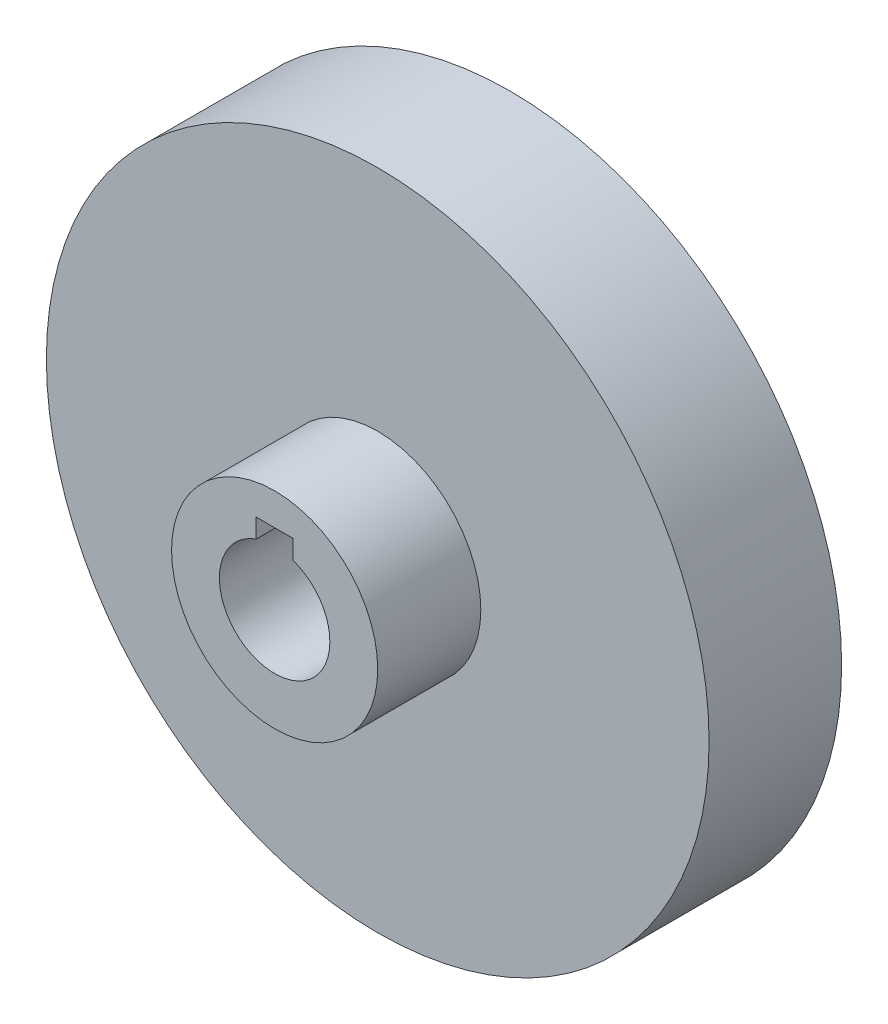
ISO-10303-21;
HEADER;
FILE_DESCRIPTION(('STEP AP214'),'2;1');
FILE_NAME('part.step','',(''),(''),'','','');
FILE_SCHEMA(('AUTOMOTIVE_DESIGN { 1 0 10303 214 1 1 1 1 }'));
ENDSEC;
DATA;
#1=APPLICATION_CONTEXT('core data for automotive mechanical design processes');
#2=APPLICATION_PROTOCOL_DEFINITION('international standard','automotive_design',2000,#1);
#3=PRODUCT_CONTEXT('',#1,'mechanical');
#4=PRODUCT('Part','Part','',(#3));
#5=PRODUCT_RELATED_PRODUCT_CATEGORY('part','',(#4));
#6=PRODUCT_DEFINITION_FORMATION('','',#4);
#7=PRODUCT_DEFINITION_CONTEXT('part definition',#1,'design');
#8=PRODUCT_DEFINITION('design','',#6,#7);
#9=PRODUCT_DEFINITION_SHAPE('','',#8);
#10=(LENGTH_UNIT() NAMED_UNIT(*) SI_UNIT(.MILLI.,.METRE.));
#11=(NAMED_UNIT(*) PLANE_ANGLE_UNIT() SI_UNIT($,.RADIAN.));
#12=(NAMED_UNIT(*) SI_UNIT($,.STERADIAN.) SOLID_ANGLE_UNIT());
#13=UNCERTAINTY_MEASURE_WITH_UNIT(LENGTH_MEASURE(1.E-05),#10,'distance_accuracy_value','');
#14=(GEOMETRIC_REPRESENTATION_CONTEXT(3) GLOBAL_UNCERTAINTY_ASSIGNED_CONTEXT((#13)) GLOBAL_UNIT_ASSIGNED_CONTEXT((#10,
#11,#12)) REPRESENTATION_CONTEXT('',''));
#15=CARTESIAN_POINT('',(0.,0.,0.));
#16=DIRECTION('',(0.,0.,1.));
#17=DIRECTION('',(1.,0.,0.));
#18=AXIS2_PLACEMENT_3D('',#15,#16,#17);
#19=CARTESIAN_POINT('',(0.,0.,42.784));
#20=DIRECTION('',(0.,0.,1.));
#21=DIRECTION('',(1.,0.,0.));
#22=AXIS2_PLACEMENT_3D('',#19,#20,#21);
#23=CYLINDRICAL_SURFACE('',#22,7.5);
#24=DIRECTION('',(0.,0.,1.));
#25=VECTOR('',#24,1.);
#26=CARTESIAN_POINT('',(-2.5,7.07106781186547,42.784));
#27=LINE('',#26,#25);
#28=CARTESIAN_POINT('',(-2.5,7.07106781186547,23.));
#29=VERTEX_POINT('',#28);
#30=CARTESIAN_POINT('',(-2.5,7.07106781186548,-12.));
#31=VERTEX_POINT('',#30);
#32=EDGE_CURVE('E96',#29,#31,#27,.F.);
#33=ORIENTED_EDGE('',*,*,#32,.F.);
#34=CARTESIAN_POINT('',(0.,0.,23.));
#35=DIRECTION('',(0.,0.,1.));
#36=DIRECTION('',(1.,0.,0.));
#37=AXIS2_PLACEMENT_3D('',#34,#35,#36);
#38=CIRCLE('',#37,7.5);
#39=CARTESIAN_POINT('',(2.5,7.07106781186547,23.));
#40=VERTEX_POINT('',#39);
#41=EDGE_CURVE('E87',#29,#40,#38,.T.);
#42=ORIENTED_EDGE('',*,*,#41,.T.);
#43=DIRECTION('',(0.,0.,1.));
#44=VECTOR('',#43,1.);
#45=CARTESIAN_POINT('',(2.5,7.07106781186547,42.784));
#46=LINE('',#45,#44);
#47=CARTESIAN_POINT('',(2.5,7.07106781186548,-12.));
#48=VERTEX_POINT('',#47);
#49=EDGE_CURVE('E92',#40,#48,#46,.F.);
#50=ORIENTED_EDGE('',*,*,#49,.T.);
#51=CARTESIAN_POINT('',(0.,0.,-12.));
#52=DIRECTION('',(0.,0.,1.));
#53=DIRECTION('',(1.,0.,0.));
#54=AXIS2_PLACEMENT_3D('',#51,#52,#53);
#55=CIRCLE('',#54,7.5);
#56=EDGE_CURVE('E98',#31,#48,#55,.T.);
#57=ORIENTED_EDGE('',*,*,#56,.F.);
#58=EDGE_LOOP('',(#33,#42,#50,#57));
#59=FACE_BOUND('',#58,.T.);
#60=ADVANCED_FACE('F32',(#59),#23,.F.);
#61=CARTESIAN_POINT('',(0.,7.5,23.));
#62=DIRECTION('',(0.,0.,-1.));
#63=DIRECTION('',(-1.,0.,0.));
#64=AXIS2_PLACEMENT_3D('',#61,#62,#63);
#65=PLANE('',#64);
#66=CARTESIAN_POINT('',(0.,0.,23.));
#67=DIRECTION('',(0.,0.,1.));
#68=DIRECTION('',(1.,0.,0.));
#69=AXIS2_PLACEMENT_3D('',#66,#67,#68);
#70=CIRCLE('',#69,14.);
#71=CARTESIAN_POINT('',(14.,0.,23.));
#72=VERTEX_POINT('',#71);
#73=EDGE_CURVE('E116',#72,#72,#70,.T.);
#74=ORIENTED_EDGE('',*,*,#73,.T.);
#75=EDGE_LOOP('',(#74));
#76=FACE_BOUND('',#75,.T.);
#77=DIRECTION('',(0.,-1.,0.));
#78=VECTOR('',#77,1.);
#79=CARTESIAN_POINT('',(-2.5,9.65,23.));
#80=LINE('',#79,#78);
#81=CARTESIAN_POINT('',(-2.5,9.65,23.));
#82=VERTEX_POINT('',#81);
#83=EDGE_CURVE('E54',#82,#29,#80,.T.);
#84=ORIENTED_EDGE('',*,*,#83,.F.);
#85=DIRECTION('',(1.,0.,0.));
#86=VECTOR('',#85,1.);
#87=CARTESIAN_POINT('',(-2.5,9.65,23.));
#88=LINE('',#87,#86);
#89=CARTESIAN_POINT('',(2.5,9.65,23.));
#90=VERTEX_POINT('',#89);
#91=EDGE_CURVE('E72',#82,#90,#88,.T.);
#92=ORIENTED_EDGE('',*,*,#91,.T.);
#93=DIRECTION('',(0.,-1.,0.));
#94=VECTOR('',#93,1.);
#95=CARTESIAN_POINT('',(2.5,9.65,23.));
#96=LINE('',#95,#94);
#97=EDGE_CURVE('E82',#90,#40,#96,.T.);
#98=ORIENTED_EDGE('',*,*,#97,.T.);
#99=ORIENTED_EDGE('',*,*,#41,.F.);
#100=EDGE_LOOP('',(#84,#92,#98,#99));
#101=FACE_BOUND('',#100,.T.);
#102=ADVANCED_FACE('F85',(#76,#101),#65,.F.);
#103=CARTESIAN_POINT('',(0.,14.,-12.));
#104=DIRECTION('',(0.,0.,1.));
#105=DIRECTION('',(1.,0.,0.));
#106=AXIS2_PLACEMENT_3D('',#103,#104,#105);
#107=PLANE('',#106);
#108=CARTESIAN_POINT('',(0.,0.,-12.));
#109=DIRECTION('',(0.,0.,1.));
#110=DIRECTION('',(1.,0.,0.));
#111=AXIS2_PLACEMENT_3D('',#108,#109,#110);
#112=CIRCLE('',#111,14.);
#113=CARTESIAN_POINT('',(14.,0.,-12.));
#114=VERTEX_POINT('',#113);
#115=EDGE_CURVE('E101',#114,#114,#112,.T.);
#116=ORIENTED_EDGE('',*,*,#115,.F.);
#117=EDGE_LOOP('',(#116));
#118=FACE_BOUND('',#117,.T.);
#119=DIRECTION('',(0.,1.,0.));
#120=VECTOR('',#119,1.);
#121=CARTESIAN_POINT('',(-2.5,14.,-12.));
#122=LINE('',#121,#120);
#123=CARTESIAN_POINT('',(-2.5,10.,-12.));
#124=VERTEX_POINT('',#123);
#125=EDGE_CURVE('E11',#31,#124,#122,.T.);
#126=ORIENTED_EDGE('',*,*,#125,.F.);
#127=ORIENTED_EDGE('',*,*,#56,.T.);
#128=DIRECTION('',(0.,1.,0.));
#129=VECTOR('',#128,1.);
#130=CARTESIAN_POINT('',(2.5,14.,-12.));
#131=LINE('',#130,#129);
#132=CARTESIAN_POINT('',(2.5,10.,-12.));
#133=VERTEX_POINT('',#132);
#134=EDGE_CURVE('E39',#48,#133,#131,.T.);
#135=ORIENTED_EDGE('',*,*,#134,.T.);
#136=DIRECTION('',(1.,0.,0.));
#137=VECTOR('',#136,1.);
#138=CARTESIAN_POINT('',(-2.5,10.,-12.));
#139=LINE('',#138,#137);
#140=EDGE_CURVE('E78',#124,#133,#139,.T.);
#141=ORIENTED_EDGE('',*,*,#140,.F.);
#142=EDGE_LOOP('',(#126,#127,#135,#141));
#143=FACE_BOUND('',#142,.T.);
#144=ADVANCED_FACE('F121',(#118,#143),#107,.F.);
#145=CARTESIAN_POINT('',(0.,0.,42.784));
#146=DIRECTION('',(0.,0.,1.));
#147=DIRECTION('',(1.,0.,0.));
#148=AXIS2_PLACEMENT_3D('',#145,#146,#147);
#149=CYLINDRICAL_SURFACE('',#148,14.);
#150=ORIENTED_EDGE('',*,*,#73,.F.);
#151=EDGE_LOOP('',(#150));
#152=FACE_BOUND('',#151,.T.);
#153=CARTESIAN_POINT('',(0.,0.,9.));
#154=DIRECTION('',(0.,0.,1.));
#155=DIRECTION('',(1.,0.,0.));
#156=AXIS2_PLACEMENT_3D('',#153,#154,#155);
#157=CIRCLE('',#156,14.);
#158=CARTESIAN_POINT('',(14.,0.,9.));
#159=VERTEX_POINT('',#158);
#160=EDGE_CURVE('E113',#159,#159,#157,.T.);
#161=ORIENTED_EDGE('',*,*,#160,.T.);
#162=EDGE_LOOP('',(#161));
#163=FACE_BOUND('',#162,.T.);
#164=ADVANCED_FACE('F133',(#152,#163),#149,.T.);
#165=CARTESIAN_POINT('',(0.,14.,9.));
#166=DIRECTION('',(0.,0.,-1.));
#167=DIRECTION('',(-1.,0.,0.));
#168=AXIS2_PLACEMENT_3D('',#165,#166,#167);
#169=PLANE('',#168);
#170=ORIENTED_EDGE('',*,*,#160,.F.);
#171=EDGE_LOOP('',(#170));
#172=FACE_BOUND('',#171,.T.);
#173=CARTESIAN_POINT('',(0.,0.,9.));
#174=DIRECTION('',(0.,0.,1.));
#175=DIRECTION('',(1.,0.,0.));
#176=AXIS2_PLACEMENT_3D('',#173,#174,#175);
#177=CIRCLE('',#176,45.);
#178=CARTESIAN_POINT('',(45.,0.,9.));
#179=VERTEX_POINT('',#178);
#180=EDGE_CURVE('E110',#179,#179,#177,.T.);
#181=ORIENTED_EDGE('',*,*,#180,.T.);
#182=EDGE_LOOP('',(#181));
#183=FACE_BOUND('',#182,.T.);
#184=ADVANCED_FACE('F139',(#172,#183),#169,.F.);
#185=CARTESIAN_POINT('',(0.,0.,42.784));
#186=DIRECTION('',(0.,0.,1.));
#187=DIRECTION('',(1.,0.,0.));
#188=AXIS2_PLACEMENT_3D('',#185,#186,#187);
#189=CYLINDRICAL_SURFACE('',#188,45.);
#190=ORIENTED_EDGE('',*,*,#180,.F.);
#191=EDGE_LOOP('',(#190));
#192=FACE_BOUND('',#191,.T.);
#193=CARTESIAN_POINT('',(0.,0.,-9.));
#194=DIRECTION('',(0.,0.,1.));
#195=DIRECTION('',(1.,0.,0.));
#196=AXIS2_PLACEMENT_3D('',#193,#194,#195);
#197=CIRCLE('',#196,45.);
#198=CARTESIAN_POINT('',(45.,0.,-9.));
#199=VERTEX_POINT('',#198);
#200=EDGE_CURVE('E107',#199,#199,#197,.T.);
#201=ORIENTED_EDGE('',*,*,#200,.T.);
#202=EDGE_LOOP('',(#201));
#203=FACE_BOUND('',#202,.T.);
#204=ADVANCED_FACE('F143',(#192,#203),#189,.T.);
#205=CARTESIAN_POINT('',(0.,45.,-9.));
#206=DIRECTION('',(0.,0.,1.));
#207=DIRECTION('',(1.,0.,0.));
#208=AXIS2_PLACEMENT_3D('',#205,#206,#207);
#209=PLANE('',#208);
#210=ORIENTED_EDGE('',*,*,#200,.F.);
#211=EDGE_LOOP('',(#210));
#212=FACE_BOUND('',#211,.T.);
#213=CARTESIAN_POINT('',(0.,0.,-9.));
#214=DIRECTION('',(0.,0.,1.));
#215=DIRECTION('',(1.,0.,0.));
#216=AXIS2_PLACEMENT_3D('',#213,#214,#215);
#217=CIRCLE('',#216,14.);
#218=CARTESIAN_POINT('',(14.,0.,-9.));
#219=VERTEX_POINT('',#218);
#220=EDGE_CURVE('E104',#219,#219,#217,.T.);
#221=ORIENTED_EDGE('',*,*,#220,.T.);
#222=EDGE_LOOP('',(#221));
#223=FACE_BOUND('',#222,.T.);
#224=ADVANCED_FACE('F147',(#212,#223),#209,.F.);
#225=CARTESIAN_POINT('',(0.,0.,42.784));
#226=DIRECTION('',(0.,0.,1.));
#227=DIRECTION('',(1.,0.,0.));
#228=AXIS2_PLACEMENT_3D('',#225,#226,#227);
#229=CYLINDRICAL_SURFACE('',#228,14.);
#230=ORIENTED_EDGE('',*,*,#220,.F.);
#231=EDGE_LOOP('',(#230));
#232=FACE_BOUND('',#231,.T.);
#233=ORIENTED_EDGE('',*,*,#115,.T.);
#234=EDGE_LOOP('',(#233));
#235=FACE_BOUND('',#234,.T.);
#236=ADVANCED_FACE('F151',(#232,#235),#229,.T.);
#237=CARTESIAN_POINT('',(-2.5,0.,0.));
#238=DIRECTION('',(1.,0.,0.));
#239=DIRECTION('',(0.,0.,-1.));
#240=AXIS2_PLACEMENT_3D('',#237,#238,#239);
#241=PLANE('',#240);
#242=ORIENTED_EDGE('',*,*,#32,.T.);
#243=ORIENTED_EDGE('',*,*,#125,.T.);
#244=DIRECTION('',(0.,-0.00999950003749686,0.999950003749688));
#245=VECTOR('',#244,1.);
#246=CARTESIAN_POINT('',(-2.5,10.,-12.));
#247=LINE('',#246,#245);
#248=EDGE_CURVE('E74',#124,#82,#247,.T.);
#249=ORIENTED_EDGE('',*,*,#248,.T.);
#250=ORIENTED_EDGE('',*,*,#83,.T.);
#251=EDGE_LOOP('',(#242,#243,#249,#250));
#252=FACE_BOUND('',#251,.T.);
#253=ADVANCED_FACE('F80',(#252),#241,.T.);
#254=CARTESIAN_POINT('',(2.5,0.,0.));
#255=DIRECTION('',(1.,0.,0.));
#256=DIRECTION('',(0.,0.,-1.));
#257=AXIS2_PLACEMENT_3D('',#254,#255,#256);
#258=PLANE('',#257);
#259=ORIENTED_EDGE('',*,*,#97,.F.);
#260=DIRECTION('',(0.,-0.00999950003749686,0.999950003749688));
#261=VECTOR('',#260,1.);
#262=CARTESIAN_POINT('',(2.5,10.,-12.));
#263=LINE('',#262,#261);
#264=EDGE_CURVE('E46',#133,#90,#263,.T.);
#265=ORIENTED_EDGE('',*,*,#264,.F.);
#266=ORIENTED_EDGE('',*,*,#134,.F.);
#267=ORIENTED_EDGE('',*,*,#49,.F.);
#268=EDGE_LOOP('',(#259,#265,#266,#267));
#269=FACE_BOUND('',#268,.T.);
#270=ADVANCED_FACE('F123',(#269),#258,.F.);
#271=CARTESIAN_POINT('',(-2.5,10.,-12.));
#272=DIRECTION('',(0.,0.999950003749688,0.00999950003749686));
#273=DIRECTION('',(0.,-0.00999950003749686,0.999950003749688));
#274=AXIS2_PLACEMENT_3D('',#271,#272,#273);
#275=PLANE('',#274);
#276=ORIENTED_EDGE('',*,*,#264,.T.);
#277=ORIENTED_EDGE('',*,*,#91,.F.);
#278=ORIENTED_EDGE('',*,*,#248,.F.);
#279=ORIENTED_EDGE('',*,*,#140,.T.);
#280=EDGE_LOOP('',(#276,#277,#278,#279));
#281=FACE_BOUND('',#280,.T.);
#282=ADVANCED_FACE('F73',(#281),#275,.F.);
#283=CLOSED_SHELL('',(#60,#102,#144,#164,#184,#204,#224,#236,#253,#270,#282));
#284=MANIFOLD_SOLID_BREP('B2',#283);
#285=ADVANCED_BREP_SHAPE_REPRESENTATION('',(#18,#284),#14);
#286=SHAPE_DEFINITION_REPRESENTATION(#9,#285);
ENDSEC;
END-ISO-10303-21;
